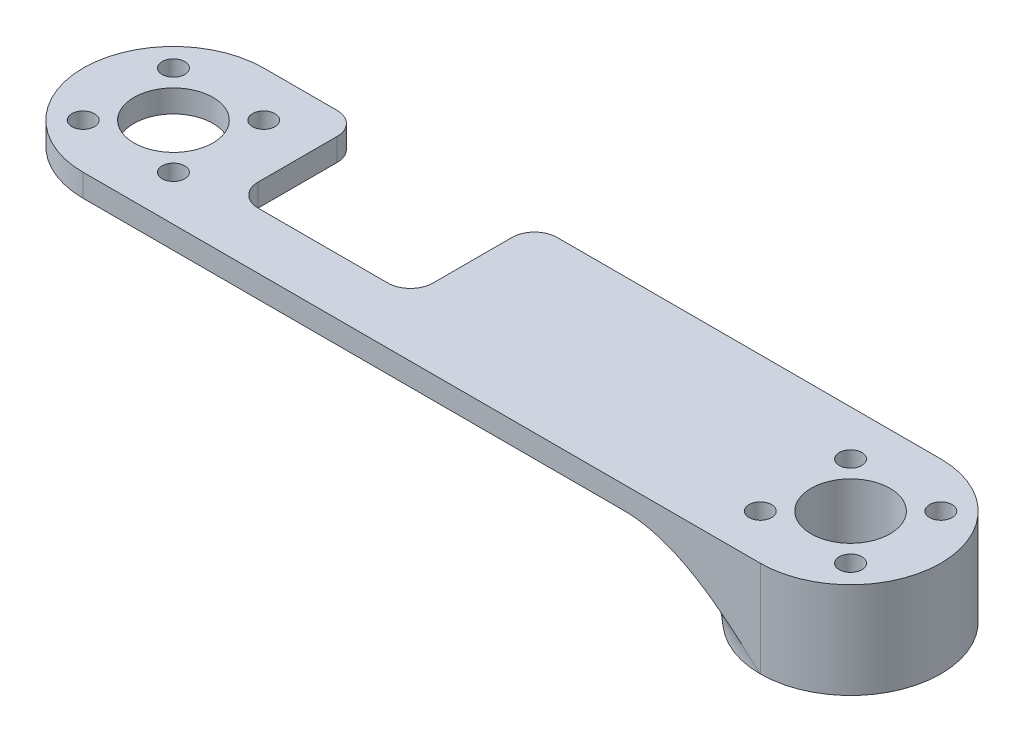
ISO-10303-21;
HEADER;
FILE_DESCRIPTION(('STEP AP214'),'2;1');
FILE_NAME('part.step','',(''),(''),'','','');
FILE_SCHEMA(('AUTOMOTIVE_DESIGN { 1 0 10303 214 1 1 1 1 }'));
ENDSEC;
DATA;
#1=APPLICATION_CONTEXT('core data for automotive mechanical design processes');
#2=APPLICATION_PROTOCOL_DEFINITION('international standard','automotive_design',2000,#1);
#3=PRODUCT_CONTEXT('',#1,'mechanical');
#4=PRODUCT('Part','Part','',(#3));
#5=PRODUCT_RELATED_PRODUCT_CATEGORY('part','',(#4));
#6=PRODUCT_DEFINITION_FORMATION('','',#4);
#7=PRODUCT_DEFINITION_CONTEXT('part definition',#1,'design');
#8=PRODUCT_DEFINITION('design','',#6,#7);
#9=PRODUCT_DEFINITION_SHAPE('','',#8);
#10=(LENGTH_UNIT() NAMED_UNIT(*) SI_UNIT(.MILLI.,.METRE.));
#11=(NAMED_UNIT(*) PLANE_ANGLE_UNIT() SI_UNIT($,.RADIAN.));
#12=(NAMED_UNIT(*) SI_UNIT($,.STERADIAN.) SOLID_ANGLE_UNIT());
#13=UNCERTAINTY_MEASURE_WITH_UNIT(LENGTH_MEASURE(1.E-05),#10,'distance_accuracy_value','');
#14=(GEOMETRIC_REPRESENTATION_CONTEXT(3) GLOBAL_UNCERTAINTY_ASSIGNED_CONTEXT((#13)) GLOBAL_UNIT_ASSIGNED_CONTEXT((#10,
#11,#12)) REPRESENTATION_CONTEXT('',''));
#15=CARTESIAN_POINT('',(0.,0.,0.));
#16=DIRECTION('',(0.,0.,1.));
#17=DIRECTION('',(1.,0.,0.));
#18=AXIS2_PLACEMENT_3D('',#15,#16,#17);
#19=CARTESIAN_POINT('',(-60.,4.,0.));
#20=DIRECTION('',(0.,1.,0.));
#21=DIRECTION('',(0.,0.,1.));
#22=AXIS2_PLACEMENT_3D('',#19,#20,#21);
#23=PLANE('',#22);
#24=CARTESIAN_POINT('',(-60.,4.,0.));
#25=DIRECTION('',(0.,1.,0.));
#26=DIRECTION('',(0.,0.,1.));
#27=AXIS2_PLACEMENT_3D('',#24,#25,#26);
#28=CIRCLE('',#27,7.);
#29=CARTESIAN_POINT('',(-60.,4.,7.));
#30=VERTEX_POINT('',#29);
#31=EDGE_CURVE('E510',#30,#30,#28,.T.);
#32=ORIENTED_EDGE('',*,*,#31,.F.);
#33=EDGE_LOOP('',(#32));
#34=FACE_BOUND('',#33,.T.);
#35=CARTESIAN_POINT('',(68.,4.,8.));
#36=DIRECTION('',(0.,1.,0.));
#37=DIRECTION('',(0.,0.,1.));
#38=AXIS2_PLACEMENT_3D('',#35,#36,#37);
#39=CIRCLE('',#38,2.);
#40=CARTESIAN_POINT('',(68.,4.,9.99999999999999));
#41=VERTEX_POINT('',#40);
#42=EDGE_CURVE('E529',#41,#41,#39,.T.);
#43=ORIENTED_EDGE('',*,*,#42,.F.);
#44=EDGE_LOOP('',(#43));
#45=FACE_BOUND('',#44,.T.);
#46=CARTESIAN_POINT('',(52.,4.,-7.99999999999999));
#47=DIRECTION('',(0.,1.,0.));
#48=DIRECTION('',(0.,0.,1.));
#49=AXIS2_PLACEMENT_3D('',#46,#47,#48);
#50=CIRCLE('',#49,2.);
#51=CARTESIAN_POINT('',(52.,4.,-5.99999999999999));
#52=VERTEX_POINT('',#51);
#53=EDGE_CURVE('E537',#52,#52,#50,.T.);
#54=ORIENTED_EDGE('',*,*,#53,.F.);
#55=EDGE_LOOP('',(#54));
#56=FACE_BOUND('',#55,.T.);
#57=CARTESIAN_POINT('',(-68.,4.,8.));
#58=DIRECTION('',(0.,1.,0.));
#59=DIRECTION('',(0.,0.,1.));
#60=AXIS2_PLACEMENT_3D('',#57,#58,#59);
#61=CIRCLE('',#60,2.);
#62=CARTESIAN_POINT('',(-68.,4.,10.));
#63=VERTEX_POINT('',#62);
#64=EDGE_CURVE('E550',#63,#63,#61,.T.);
#65=ORIENTED_EDGE('',*,*,#64,.F.);
#66=EDGE_LOOP('',(#65));
#67=FACE_BOUND('',#66,.T.);
#68=CARTESIAN_POINT('',(-52.,4.,-8.));
#69=DIRECTION('',(0.,1.,0.));
#70=DIRECTION('',(0.,0.,1.));
#71=AXIS2_PLACEMENT_3D('',#68,#69,#70);
#72=CIRCLE('',#71,2.);
#73=CARTESIAN_POINT('',(-52.,4.,-6.));
#74=VERTEX_POINT('',#73);
#75=EDGE_CURVE('E566',#74,#74,#72,.T.);
#76=ORIENTED_EDGE('',*,*,#75,.F.);
#77=EDGE_LOOP('',(#76));
#78=FACE_BOUND('',#77,.T.);
#79=DIRECTION('',(-1.,0.,0.));
#80=VECTOR('',#79,1.);
#81=CARTESIAN_POINT('',(-12.,4.,-16.));
#82=LINE('',#81,#80);
#83=CARTESIAN_POINT('',(60.,4.,-16.));
#84=VERTEX_POINT('',#83);
#85=CARTESIAN_POINT('',(-7.99999999999999,4.,-16.));
#86=VERTEX_POINT('',#85);
#87=EDGE_CURVE('E575',#84,#86,#82,.T.);
#88=ORIENTED_EDGE('',*,*,#87,.T.);
#89=CARTESIAN_POINT('',(-7.99999999999998,4.,-12.));
#90=DIRECTION('',(0.,1.,0.));
#91=DIRECTION('',(0.,0.,1.));
#92=AXIS2_PLACEMENT_3D('',#89,#90,#91);
#93=CIRCLE('',#92,4.);
#94=CARTESIAN_POINT('',(-12.,4.,-12.));
#95=VERTEX_POINT('',#94);
#96=EDGE_CURVE('E210',#86,#95,#93,.T.);
#97=ORIENTED_EDGE('',*,*,#96,.T.);
#98=DIRECTION('',(0.,0.,1.));
#99=VECTOR('',#98,1.);
#100=CARTESIAN_POINT('',(-12.,4.,-16.));
#101=LINE('',#100,#99);
#102=CARTESIAN_POINT('',(-12.,4.,2.));
#103=VERTEX_POINT('',#102);
#104=EDGE_CURVE('E578',#95,#103,#101,.T.);
#105=ORIENTED_EDGE('',*,*,#104,.T.);
#106=CARTESIAN_POINT('',(-16.,4.,2.));
#107=DIRECTION('',(0.,1.,0.));
#108=DIRECTION('',(0.,0.,1.));
#109=AXIS2_PLACEMENT_3D('',#106,#107,#108);
#110=CIRCLE('',#109,4.);
#111=CARTESIAN_POINT('',(-16.,4.,6.));
#112=VERTEX_POINT('',#111);
#113=EDGE_CURVE('E226',#103,#112,#110,.F.);
#114=ORIENTED_EDGE('',*,*,#113,.T.);
#115=DIRECTION('',(-1.,0.,0.));
#116=VECTOR('',#115,1.);
#117=CARTESIAN_POINT('',(-43.,4.,6.));
#118=LINE('',#117,#116);
#119=CARTESIAN_POINT('',(-39.,4.,6.));
#120=VERTEX_POINT('',#119);
#121=EDGE_CURVE('E582',#112,#120,#118,.T.);
#122=ORIENTED_EDGE('',*,*,#121,.T.);
#123=CARTESIAN_POINT('',(-39.,4.,2.));
#124=DIRECTION('',(0.,1.,0.));
#125=DIRECTION('',(0.,0.,1.));
#126=AXIS2_PLACEMENT_3D('',#123,#124,#125);
#127=CIRCLE('',#126,4.);
#128=CARTESIAN_POINT('',(-43.,4.,2.));
#129=VERTEX_POINT('',#128);
#130=EDGE_CURVE('E220',#120,#129,#127,.F.);
#131=ORIENTED_EDGE('',*,*,#130,.T.);
#132=DIRECTION('',(0.,0.,-1.));
#133=VECTOR('',#132,1.);
#134=CARTESIAN_POINT('',(-43.,4.,-6.));
#135=LINE('',#134,#133);
#136=CARTESIAN_POINT('',(-43.,4.,-12.));
#137=VERTEX_POINT('',#136);
#138=EDGE_CURVE('E586',#129,#137,#135,.T.);
#139=ORIENTED_EDGE('',*,*,#138,.T.);
#140=CARTESIAN_POINT('',(-47.,4.,-12.));
#141=DIRECTION('',(0.,1.,0.));
#142=DIRECTION('',(0.,0.,1.));
#143=AXIS2_PLACEMENT_3D('',#140,#141,#142);
#144=CIRCLE('',#143,4.);
#145=CARTESIAN_POINT('',(-47.,4.,-16.));
#146=VERTEX_POINT('',#145);
#147=EDGE_CURVE('E207',#137,#146,#144,.T.);
#148=ORIENTED_EDGE('',*,*,#147,.T.);
#149=DIRECTION('',(-1.,0.,0.));
#150=VECTOR('',#149,1.);
#151=CARTESIAN_POINT('',(-60.,4.,-16.));
#152=LINE('',#151,#150);
#153=CARTESIAN_POINT('',(-60.,4.,-16.));
#154=VERTEX_POINT('',#153);
#155=EDGE_CURVE('E160',#146,#154,#152,.T.);
#156=ORIENTED_EDGE('',*,*,#155,.T.);
#157=CARTESIAN_POINT('',(-60.,4.,0.));
#158=DIRECTION('',(0.,1.,0.));
#159=DIRECTION('',(0.,0.,1.));
#160=AXIS2_PLACEMENT_3D('',#157,#158,#159);
#161=CIRCLE('',#160,16.);
#162=CARTESIAN_POINT('',(-60.,4.,16.));
#163=VERTEX_POINT('',#162);
#164=EDGE_CURVE('E154',#154,#163,#161,.T.);
#165=ORIENTED_EDGE('',*,*,#164,.T.);
#166=DIRECTION('',(1.,0.,0.));
#167=VECTOR('',#166,1.);
#168=CARTESIAN_POINT('',(-60.,4.,16.));
#169=LINE('',#168,#167);
#170=CARTESIAN_POINT('',(60.,4.,16.));
#171=VERTEX_POINT('',#170);
#172=EDGE_CURVE('E144',#163,#171,#169,.T.);
#173=ORIENTED_EDGE('',*,*,#172,.T.);
#174=CARTESIAN_POINT('',(60.,4.,0.));
#175=DIRECTION('',(0.,1.,0.));
#176=DIRECTION('',(0.,0.,1.));
#177=AXIS2_PLACEMENT_3D('',#174,#175,#176);
#178=CIRCLE('',#177,16.);
#179=EDGE_CURVE('E153',#171,#84,#178,.T.);
#180=ORIENTED_EDGE('',*,*,#179,.T.);
#181=EDGE_LOOP('',(#88,#97,#105,#114,#122,#131,#139,#148,#156,#165,#173,#180));
#182=FACE_BOUND('',#181,.T.);
#183=CARTESIAN_POINT('',(-52.,4.,8.));
#184=DIRECTION('',(0.,1.,0.));
#185=DIRECTION('',(0.,0.,1.));
#186=AXIS2_PLACEMENT_3D('',#183,#184,#185);
#187=CIRCLE('',#186,2.);
#188=CARTESIAN_POINT('',(-52.,4.,10.));
#189=VERTEX_POINT('',#188);
#190=EDGE_CURVE('E558',#189,#189,#187,.T.);
#191=ORIENTED_EDGE('',*,*,#190,.F.);
#192=EDGE_LOOP('',(#191));
#193=FACE_BOUND('',#192,.T.);
#194=CARTESIAN_POINT('',(-68.,4.,-8.));
#195=DIRECTION('',(0.,1.,0.));
#196=DIRECTION('',(0.,0.,1.));
#197=AXIS2_PLACEMENT_3D('',#194,#195,#196);
#198=CIRCLE('',#197,2.);
#199=CARTESIAN_POINT('',(-68.,4.,-6.));
#200=VERTEX_POINT('',#199);
#201=EDGE_CURVE('E542',#200,#200,#198,.T.);
#202=ORIENTED_EDGE('',*,*,#201,.F.);
#203=EDGE_LOOP('',(#202));
#204=FACE_BOUND('',#203,.T.);
#205=CARTESIAN_POINT('',(68.,4.,-8.));
#206=DIRECTION('',(0.,1.,0.));
#207=DIRECTION('',(0.,0.,1.));
#208=AXIS2_PLACEMENT_3D('',#205,#206,#207);
#209=CIRCLE('',#208,2.);
#210=CARTESIAN_POINT('',(68.,4.,-6.));
#211=VERTEX_POINT('',#210);
#212=EDGE_CURVE('E533',#211,#211,#209,.T.);
#213=ORIENTED_EDGE('',*,*,#212,.F.);
#214=EDGE_LOOP('',(#213));
#215=FACE_BOUND('',#214,.T.);
#216=CARTESIAN_POINT('',(52.,4.,8.00000000000001));
#217=DIRECTION('',(0.,1.,0.));
#218=DIRECTION('',(0.,0.,1.));
#219=AXIS2_PLACEMENT_3D('',#216,#217,#218);
#220=CIRCLE('',#219,2.);
#221=CARTESIAN_POINT('',(52.,4.,10.));
#222=VERTEX_POINT('',#221);
#223=EDGE_CURVE('E520',#222,#222,#220,.T.);
#224=ORIENTED_EDGE('',*,*,#223,.F.);
#225=EDGE_LOOP('',(#224));
#226=FACE_BOUND('',#225,.T.);
#227=CARTESIAN_POINT('',(60.,4.,0.));
#228=DIRECTION('',(0.,1.,0.));
#229=DIRECTION('',(0.,0.,1.));
#230=AXIS2_PLACEMENT_3D('',#227,#228,#229);
#231=CIRCLE('',#230,6.99999999999999);
#232=CARTESIAN_POINT('',(60.,4.,6.99999999999999));
#233=VERTEX_POINT('',#232);
#234=EDGE_CURVE('E516',#233,#233,#231,.T.);
#235=ORIENTED_EDGE('',*,*,#234,.F.);
#236=EDGE_LOOP('',(#235));
#237=FACE_BOUND('',#236,.T.);
#238=ADVANCED_FACE('F41',(#34,#45,#56,#67,#78,#182,#193,#204,#215,#226,#237),#23,.T.);
#239=CARTESIAN_POINT('',(-60.,0.,0.));
#240=DIRECTION('',(0.,1.,0.));
#241=DIRECTION('',(0.,0.,1.));
#242=AXIS2_PLACEMENT_3D('',#239,#240,#241);
#243=PLANE('',#242);
#244=DIRECTION('',(-1.,0.,0.));
#245=VECTOR('',#244,1.);
#246=CARTESIAN_POINT('',(-12.,0.,-16.));
#247=LINE('',#246,#245);
#248=CARTESIAN_POINT('',(35.8132267551044,0.,-16.));
#249=VERTEX_POINT('',#248);
#250=CARTESIAN_POINT('',(-7.99999999999999,0.,-16.));
#251=VERTEX_POINT('',#250);
#252=EDGE_CURVE('E598',#249,#251,#247,.T.);
#253=ORIENTED_EDGE('',*,*,#252,.F.);
#254=CARTESIAN_POINT('',(60.,0.,0.));
#255=DIRECTION('',(0.,1.,0.));
#256=DIRECTION('',(0.,0.,1.));
#257=AXIS2_PLACEMENT_3D('',#254,#255,#256);
#258=CIRCLE('',#257,29.);
#259=CARTESIAN_POINT('',(35.8132267551043,0.,16.));
#260=VERTEX_POINT('',#259);
#261=EDGE_CURVE('E229',#249,#260,#258,.T.);
#262=ORIENTED_EDGE('',*,*,#261,.T.);
#263=DIRECTION('',(1.,0.,0.));
#264=VECTOR('',#263,1.);
#265=CARTESIAN_POINT('',(4.00000000000001,0.,16.));
#266=LINE('',#265,#264);
#267=CARTESIAN_POINT('',(-60.,0.,16.));
#268=VERTEX_POINT('',#267);
#269=EDGE_CURVE('E595',#268,#260,#266,.T.);
#270=ORIENTED_EDGE('',*,*,#269,.F.);
#271=CARTESIAN_POINT('',(-60.,0.,0.));
#272=DIRECTION('',(0.,1.,0.));
#273=DIRECTION('',(0.,0.,1.));
#274=AXIS2_PLACEMENT_3D('',#271,#272,#273);
#275=CIRCLE('',#274,16.);
#276=CARTESIAN_POINT('',(-60.,0.,-16.));
#277=VERTEX_POINT('',#276);
#278=EDGE_CURVE('E169',#277,#268,#275,.T.);
#279=ORIENTED_EDGE('',*,*,#278,.F.);
#280=DIRECTION('',(-1.,0.,0.));
#281=VECTOR('',#280,1.);
#282=CARTESIAN_POINT('',(-60.,0.,-16.));
#283=LINE('',#282,#281);
#284=CARTESIAN_POINT('',(-47.,0.,-16.));
#285=VERTEX_POINT('',#284);
#286=EDGE_CURVE('E165',#285,#277,#283,.T.);
#287=ORIENTED_EDGE('',*,*,#286,.F.);
#288=CARTESIAN_POINT('',(-47.,0.,-12.));
#289=DIRECTION('',(0.,1.,0.));
#290=DIRECTION('',(0.,0.,1.));
#291=AXIS2_PLACEMENT_3D('',#288,#289,#290);
#292=CIRCLE('',#291,4.);
#293=CARTESIAN_POINT('',(-43.,0.,-12.));
#294=VERTEX_POINT('',#293);
#295=EDGE_CURVE('E197',#285,#294,#292,.F.);
#296=ORIENTED_EDGE('',*,*,#295,.T.);
#297=DIRECTION('',(0.,0.,-1.));
#298=VECTOR('',#297,1.);
#299=CARTESIAN_POINT('',(-43.,0.,-16.));
#300=LINE('',#299,#298);
#301=CARTESIAN_POINT('',(-43.,0.,2.));
#302=VERTEX_POINT('',#301);
#303=EDGE_CURVE('E609',#302,#294,#300,.T.);
#304=ORIENTED_EDGE('',*,*,#303,.F.);
#305=CARTESIAN_POINT('',(-39.,0.,2.));
#306=DIRECTION('',(0.,1.,0.));
#307=DIRECTION('',(0.,0.,1.));
#308=AXIS2_PLACEMENT_3D('',#305,#306,#307);
#309=CIRCLE('',#308,4.);
#310=CARTESIAN_POINT('',(-39.,0.,6.));
#311=VERTEX_POINT('',#310);
#312=EDGE_CURVE('E217',#302,#311,#309,.T.);
#313=ORIENTED_EDGE('',*,*,#312,.T.);
#314=DIRECTION('',(-1.,0.,0.));
#315=VECTOR('',#314,1.);
#316=CARTESIAN_POINT('',(-43.,0.,6.));
#317=LINE('',#316,#315);
#318=CARTESIAN_POINT('',(-16.,0.,6.));
#319=VERTEX_POINT('',#318);
#320=EDGE_CURVE('E605',#319,#311,#317,.T.);
#321=ORIENTED_EDGE('',*,*,#320,.F.);
#322=CARTESIAN_POINT('',(-16.,0.,2.));
#323=DIRECTION('',(0.,1.,0.));
#324=DIRECTION('',(0.,0.,1.));
#325=AXIS2_PLACEMENT_3D('',#322,#323,#324);
#326=CIRCLE('',#325,4.);
#327=CARTESIAN_POINT('',(-12.,0.,2.));
#328=VERTEX_POINT('',#327);
#329=EDGE_CURVE('E223',#319,#328,#326,.T.);
#330=ORIENTED_EDGE('',*,*,#329,.T.);
#331=DIRECTION('',(0.,0.,1.));
#332=VECTOR('',#331,1.);
#333=CARTESIAN_POINT('',(-12.,0.,-6.00000000000001));
#334=LINE('',#333,#332);
#335=CARTESIAN_POINT('',(-12.,0.,-12.));
#336=VERTEX_POINT('',#335);
#337=EDGE_CURVE('E601',#336,#328,#334,.T.);
#338=ORIENTED_EDGE('',*,*,#337,.F.);
#339=CARTESIAN_POINT('',(-7.99999999999998,0.,-12.));
#340=DIRECTION('',(0.,1.,0.));
#341=DIRECTION('',(0.,0.,1.));
#342=AXIS2_PLACEMENT_3D('',#339,#340,#341);
#343=CIRCLE('',#342,4.);
#344=EDGE_CURVE('E200',#336,#251,#343,.F.);
#345=ORIENTED_EDGE('',*,*,#344,.T.);
#346=EDGE_LOOP('',(#253,#262,#270,#279,#287,#296,#304,#313,#321,#330,#338,#345));
#347=FACE_BOUND('',#346,.T.);
#348=CARTESIAN_POINT('',(-52.,0.,-8.));
#349=DIRECTION('',(0.,1.,0.));
#350=DIRECTION('',(0.,0.,1.));
#351=AXIS2_PLACEMENT_3D('',#348,#349,#350);
#352=CIRCLE('',#351,2.);
#353=CARTESIAN_POINT('',(-52.,0.,-6.));
#354=VERTEX_POINT('',#353);
#355=EDGE_CURVE('E562',#354,#354,#352,.T.);
#356=ORIENTED_EDGE('',*,*,#355,.T.);
#357=EDGE_LOOP('',(#356));
#358=FACE_BOUND('',#357,.T.);
#359=CARTESIAN_POINT('',(-52.,0.,8.));
#360=DIRECTION('',(0.,1.,0.));
#361=DIRECTION('',(0.,0.,1.));
#362=AXIS2_PLACEMENT_3D('',#359,#360,#361);
#363=CIRCLE('',#362,2.);
#364=CARTESIAN_POINT('',(-52.,0.,10.));
#365=VERTEX_POINT('',#364);
#366=EDGE_CURVE('E554',#365,#365,#363,.T.);
#367=ORIENTED_EDGE('',*,*,#366,.T.);
#368=EDGE_LOOP('',(#367));
#369=FACE_BOUND('',#368,.T.);
#370=CARTESIAN_POINT('',(-68.,0.,8.));
#371=DIRECTION('',(0.,1.,0.));
#372=DIRECTION('',(0.,0.,1.));
#373=AXIS2_PLACEMENT_3D('',#370,#371,#372);
#374=CIRCLE('',#373,2.);
#375=CARTESIAN_POINT('',(-68.,0.,10.));
#376=VERTEX_POINT('',#375);
#377=EDGE_CURVE('E546',#376,#376,#374,.T.);
#378=ORIENTED_EDGE('',*,*,#377,.T.);
#379=EDGE_LOOP('',(#378));
#380=FACE_BOUND('',#379,.T.);
#381=CARTESIAN_POINT('',(-68.,0.,-8.));
#382=DIRECTION('',(0.,1.,0.));
#383=DIRECTION('',(0.,0.,1.));
#384=AXIS2_PLACEMENT_3D('',#381,#382,#383);
#385=CIRCLE('',#384,2.);
#386=CARTESIAN_POINT('',(-68.,0.,-6.));
#387=VERTEX_POINT('',#386);
#388=EDGE_CURVE('E541',#387,#387,#385,.T.);
#389=ORIENTED_EDGE('',*,*,#388,.T.);
#390=EDGE_LOOP('',(#389));
#391=FACE_BOUND('',#390,.T.);
#392=CARTESIAN_POINT('',(-60.,0.,0.));
#393=DIRECTION('',(0.,1.,0.));
#394=DIRECTION('',(0.,0.,1.));
#395=AXIS2_PLACEMENT_3D('',#392,#393,#394);
#396=CIRCLE('',#395,7.);
#397=CARTESIAN_POINT('',(-60.,0.,7.));
#398=VERTEX_POINT('',#397);
#399=EDGE_CURVE('E513',#398,#398,#396,.T.);
#400=ORIENTED_EDGE('',*,*,#399,.T.);
#401=EDGE_LOOP('',(#400));
#402=FACE_BOUND('',#401,.T.);
#403=ADVANCED_FACE('F245',(#347,#358,#369,#380,#391,#402),#243,.F.);
#404=CARTESIAN_POINT('',(-60.,4.,0.));
#405=DIRECTION('',(0.,-1.,0.));
#406=DIRECTION('',(0.,0.,-1.));
#407=AXIS2_PLACEMENT_3D('',#404,#405,#406);
#408=CYLINDRICAL_SURFACE('',#407,16.);
#409=ORIENTED_EDGE('',*,*,#278,.T.);
#410=DIRECTION('',(0.,-1.,0.));
#411=VECTOR('',#410,1.);
#412=CARTESIAN_POINT('',(-60.,4.,16.));
#413=LINE('',#412,#411);
#414=EDGE_CURVE('E149',#163,#268,#413,.T.);
#415=ORIENTED_EDGE('',*,*,#414,.F.);
#416=ORIENTED_EDGE('',*,*,#164,.F.);
#417=DIRECTION('',(0.,-1.,0.));
#418=VECTOR('',#417,1.);
#419=CARTESIAN_POINT('',(-60.,4.,-16.));
#420=LINE('',#419,#418);
#421=EDGE_CURVE('E592',#154,#277,#420,.T.);
#422=ORIENTED_EDGE('',*,*,#421,.T.);
#423=EDGE_LOOP('',(#409,#415,#416,#422));
#424=FACE_BOUND('',#423,.T.);
#425=ADVANCED_FACE('F167',(#424),#408,.T.);
#426=CARTESIAN_POINT('',(4.00000000000001,4.,16.));
#427=DIRECTION('',(0.,0.,-1.));
#428=DIRECTION('',(-1.,0.,0.));
#429=AXIS2_PLACEMENT_3D('',#426,#427,#428);
#430=PLANE('',#429);
#431=ORIENTED_EDGE('',*,*,#269,.T.);
#432=CARTESIAN_POINT('',(35.8132267551043,0.,16.));
#433=CARTESIAN_POINT('',(36.0905895316791,3.02866078322834E-07,16.));
#434=CARTESIAN_POINT('',(36.3679057361623,-0.00617501172120525,16.));
#435=CARTESIAN_POINT('',(36.9219715713356,-0.0304686559429765,16.));
#436=CARTESIAN_POINT('',(37.1987212877857,-0.0485850192045447,16.));
#437=CARTESIAN_POINT('',(38.0267084699584,-0.120164139883938,16.));
#438=CARTESIAN_POINT('',(38.5765291000872,-0.190859453805513,16.));
#439=CARTESIAN_POINT('',(39.6629336402259,-0.373707082134891,16.));
#440=CARTESIAN_POINT('',(40.1995964721728,-0.485400275331651,16.));
#441=CARTESIAN_POINT('',(41.2637481363507,-0.746832848812867,16.));
#442=CARTESIAN_POINT('',(41.7912326126964,-0.896589794170852,16.));
#443=CARTESIAN_POINT('',(43.1164305828713,-1.32061035963194,16.));
#444=CARTESIAN_POINT('',(43.9066351383689,-1.61848579826866,16.));
#445=CARTESIAN_POINT('',(45.4573678596935,-2.28325678648619,16.));
#446=CARTESIAN_POINT('',(46.2178828333713,-2.65018260548694,16.));
#447=CARTESIAN_POINT('',(47.7125182288725,-3.44319238571225,16.));
#448=CARTESIAN_POINT('',(48.4464704754503,-3.86959061662994,16.));
#449=CARTESIAN_POINT('',(49.8850321136033,-4.76872961475223,16.));
#450=CARTESIAN_POINT('',(50.5896446935562,-5.24146532758027,16.));
#451=CARTESIAN_POINT('',(52.8224259277187,-6.82593289700588,16.));
#452=CARTESIAN_POINT('',(54.299207631324,-8.00937667003384,16.0000000000002));
#453=CARTESIAN_POINT('',(57.1776844033528,-10.456239375237,15.9999999999998));
#454=CARTESIAN_POINT('',(58.579472445293,-11.7195548355447,15.9999999999992));
#455=CARTESIAN_POINT('',(59.9874726330951,-12.9887079858511,16.));
#456=CARTESIAN_POINT('',(59.9937363154344,-12.9943539928172,16.));
#457=CARTESIAN_POINT('',(60.,-13.,16.));
#458=B_SPLINE_CURVE_WITH_KNOTS('',3,(#432,#433,#434,#435,#436,#437,#438,#439,#440,#441,#442,
#443,#444,#445,#446,#447,#448,#449,#450,#451,#452,#453,#454,#455,#456,#457),.UNSPECIFIED.,.F.,
.F.,(4,2,2,2,2,2,2,2,2,2,2,2,4),(0.,0.831936503229665,1.66373604287356,3.32480797018764,
4.96781900470678,6.61158961156077,9.14089547178664,11.6713126904196,14.2156471769886,
16.7597044421053,22.4283388828887,28.0897745241612,28.1150727454427),.UNSPECIFIED.);
#459=CARTESIAN_POINT('',(60.,-13.,16.));
#460=VERTEX_POINT('',#459);
#461=EDGE_CURVE('E56',#260,#460,#458,.T.);
#462=ORIENTED_EDGE('',*,*,#461,.T.);
#463=DIRECTION('',(0.,-1.,0.));
#464=VECTOR('',#463,1.);
#465=CARTESIAN_POINT('',(60.,4.,16.));
#466=LINE('',#465,#464);
#467=EDGE_CURVE('E70',#171,#460,#466,.T.);
#468=ORIENTED_EDGE('',*,*,#467,.F.);
#469=ORIENTED_EDGE('',*,*,#172,.F.);
#470=ORIENTED_EDGE('',*,*,#414,.T.);
#471=EDGE_LOOP('',(#431,#462,#468,#469,#470));
#472=FACE_BOUND('',#471,.T.);
#473=ADVANCED_FACE('F147',(#472),#430,.F.);
#474=CARTESIAN_POINT('',(60.,4.,0.));
#475=DIRECTION('',(0.,-1.,0.));
#476=DIRECTION('',(0.,0.,-1.));
#477=AXIS2_PLACEMENT_3D('',#474,#475,#476);
#478=CYLINDRICAL_SURFACE('',#477,16.);
#479=ORIENTED_EDGE('',*,*,#467,.T.);
#480=CARTESIAN_POINT('',(60.,-13.,0.));
#481=DIRECTION('',(0.,1.,0.));
#482=DIRECTION('',(0.,0.,1.));
#483=AXIS2_PLACEMENT_3D('',#480,#481,#482);
#484=CIRCLE('',#483,16.);
#485=CARTESIAN_POINT('',(60.,-13.,-16.));
#486=VERTEX_POINT('',#485);
#487=EDGE_CURVE('E523',#460,#486,#484,.T.);
#488=ORIENTED_EDGE('',*,*,#487,.T.);
#489=DIRECTION('',(0.,-1.,0.));
#490=VECTOR('',#489,1.);
#491=CARTESIAN_POINT('',(60.,4.,-16.));
#492=LINE('',#491,#490);
#493=EDGE_CURVE('E62',#84,#486,#492,.T.);
#494=ORIENTED_EDGE('',*,*,#493,.F.);
#495=ORIENTED_EDGE('',*,*,#179,.F.);
#496=EDGE_LOOP('',(#479,#488,#494,#495));
#497=FACE_BOUND('',#496,.T.);
#498=ADVANCED_FACE('F242',(#497),#478,.T.);
#499=CARTESIAN_POINT('',(-12.,4.,-16.));
#500=DIRECTION('',(0.,0.,1.));
#501=DIRECTION('',(1.,0.,0.));
#502=AXIS2_PLACEMENT_3D('',#499,#500,#501);
#503=PLANE('',#502);
#504=ORIENTED_EDGE('',*,*,#493,.T.);
#505=CARTESIAN_POINT('',(35.8132267551044,0.,-16.));
#506=CARTESIAN_POINT('',(36.0905895316905,3.02866078327603E-07,-16.));
#507=CARTESIAN_POINT('',(36.3679057361851,-0.00617501172171388,-16.));
#508=CARTESIAN_POINT('',(36.9219715713812,-0.0304686559454683,-16.));
#509=CARTESIAN_POINT('',(37.1987212878427,-0.0485850192085109,-16.));
#510=CARTESIAN_POINT('',(38.0267084700503,-0.12016413989379,-16.));
#511=CARTESIAN_POINT('',(38.5765291002025,-0.190859453821235,-16.));
#512=CARTESIAN_POINT('',(39.6629336403411,-0.373707082157923,-16.));
#513=CARTESIAN_POINT('',(40.1995964722649,-0.485400275352556,-16.));
#514=CARTESIAN_POINT('',(41.2637481363967,-0.746832848825881,-16.));
#515=CARTESIAN_POINT('',(41.7912326127192,-0.896589794178033,-16.));
#516=CARTESIAN_POINT('',(43.1164305828489,-1.32061035962494,-16.));
#517=CARTESIAN_POINT('',(43.9066351383246,-1.61848579825275,-16.));
#518=CARTESIAN_POINT('',(45.4573678596121,-2.28325678644818,-16.));
#519=CARTESIAN_POINT('',(46.2178828332747,-2.65018260543602,-16.));
#520=CARTESIAN_POINT('',(47.7125182287796,-3.44319238566261,-16.));
#521=CARTESIAN_POINT('',(48.4464704753747,-3.8695906165976,-16.));
#522=CARTESIAN_POINT('',(49.8850321135813,-4.76872961472348,-16.));
#523=CARTESIAN_POINT('',(50.5896446935709,-5.24146532753739,-16.0000000000001));
#524=CARTESIAN_POINT('',(52.8224259276704,-6.82593289709011,-15.9999999999999));
#525=CARTESIAN_POINT('',(54.2992076309741,-8.00937667048346,-15.9999999999995));
#526=CARTESIAN_POINT('',(57.177684403765,-10.456239374841,-16.0000000000005));
#527=CARTESIAN_POINT('',(58.5794724467688,-11.719554833938,-16.0000000000018));
#528=CARTESIAN_POINT('',(59.9874726331081,-12.9887079858366,-16.));
#529=CARTESIAN_POINT('',(59.9937363154409,-12.99435399281,-16.));
#530=CARTESIAN_POINT('',(60.,-13.,-16.));
#531=B_SPLINE_CURVE_WITH_KNOTS('',3,(#505,#506,#507,#508,#509,#510,#511,#512,#513,#514,#515,
#516,#517,#518,#519,#520,#521,#522,#523,#524,#525,#526,#527,#528,#529,#530),.UNSPECIFIED.,.F.,
.F.,(4,2,2,2,2,2,2,2,2,2,2,2,4),(0.,0.831936503263906,1.66373604294203,3.32480797032782,
4.96781900477834,6.6115896115608,9.14089547171659,11.6713126902899,14.2156471769348,
16.7597044421055,22.4283388829504,28.0897745241614,28.115072745443),.UNSPECIFIED.);
#532=EDGE_CURVE('E11',#486,#249,#531,.F.);
#533=ORIENTED_EDGE('',*,*,#532,.T.);
#534=ORIENTED_EDGE('',*,*,#252,.T.);
#535=DIRECTION('',(0.,-1.,0.));
#536=VECTOR('',#535,1.);
#537=CARTESIAN_POINT('',(-7.99999999999999,4.,-16.));
#538=LINE('',#537,#536);
#539=EDGE_CURVE('E204',#251,#86,#538,.F.);
#540=ORIENTED_EDGE('',*,*,#539,.T.);
#541=ORIENTED_EDGE('',*,*,#87,.F.);
#542=EDGE_LOOP('',(#504,#533,#534,#540,#541));
#543=FACE_BOUND('',#542,.T.);
#544=ADVANCED_FACE('F298',(#543),#503,.F.);
#545=CARTESIAN_POINT('',(-12.,4.,-6.00000000000001));
#546=DIRECTION('',(1.,0.,0.));
#547=DIRECTION('',(0.,0.,-1.));
#548=AXIS2_PLACEMENT_3D('',#545,#546,#547);
#549=PLANE('',#548);
#550=ORIENTED_EDGE('',*,*,#337,.T.);
#551=DIRECTION('',(0.,-1.,0.));
#552=VECTOR('',#551,1.);
#553=CARTESIAN_POINT('',(-12.,4.,2.));
#554=LINE('',#553,#552);
#555=EDGE_CURVE('E194',#328,#103,#554,.F.);
#556=ORIENTED_EDGE('',*,*,#555,.T.);
#557=ORIENTED_EDGE('',*,*,#104,.F.);
#558=DIRECTION('',(0.,-1.,0.));
#559=VECTOR('',#558,1.);
#560=CARTESIAN_POINT('',(-12.,4.,-12.));
#561=LINE('',#560,#559);
#562=EDGE_CURVE('E190',#95,#336,#561,.T.);
#563=ORIENTED_EDGE('',*,*,#562,.T.);
#564=EDGE_LOOP('',(#550,#556,#557,#563));
#565=FACE_BOUND('',#564,.T.);
#566=ADVANCED_FACE('F296',(#565),#549,.F.);
#567=CARTESIAN_POINT('',(-43.,4.,6.));
#568=DIRECTION('',(0.,0.,1.));
#569=DIRECTION('',(1.,0.,0.));
#570=AXIS2_PLACEMENT_3D('',#567,#568,#569);
#571=PLANE('',#570);
#572=ORIENTED_EDGE('',*,*,#320,.T.);
#573=DIRECTION('',(0.,-1.,0.));
#574=VECTOR('',#573,1.);
#575=CARTESIAN_POINT('',(-39.,4.,6.));
#576=LINE('',#575,#574);
#577=EDGE_CURVE('E187',#311,#120,#576,.F.);
#578=ORIENTED_EDGE('',*,*,#577,.T.);
#579=ORIENTED_EDGE('',*,*,#121,.F.);
#580=DIRECTION('',(0.,-1.,0.));
#581=VECTOR('',#580,1.);
#582=CARTESIAN_POINT('',(-16.,0.,6.));
#583=LINE('',#582,#581);
#584=EDGE_CURVE('E183',#112,#319,#583,.T.);
#585=ORIENTED_EDGE('',*,*,#584,.T.);
#586=EDGE_LOOP('',(#572,#578,#579,#585));
#587=FACE_BOUND('',#586,.T.);
#588=ADVANCED_FACE('F292',(#587),#571,.F.);
#589=CARTESIAN_POINT('',(-43.,4.,-16.));
#590=DIRECTION('',(-1.,0.,0.));
#591=DIRECTION('',(0.,0.,1.));
#592=AXIS2_PLACEMENT_3D('',#589,#590,#591);
#593=PLANE('',#592);
#594=ORIENTED_EDGE('',*,*,#138,.F.);
#595=DIRECTION('',(0.,-1.,0.));
#596=VECTOR('',#595,1.);
#597=CARTESIAN_POINT('',(-43.,0.,2.));
#598=LINE('',#597,#596);
#599=EDGE_CURVE('E175',#129,#302,#598,.T.);
#600=ORIENTED_EDGE('',*,*,#599,.T.);
#601=ORIENTED_EDGE('',*,*,#303,.T.);
#602=DIRECTION('',(0.,-1.,0.));
#603=VECTOR('',#602,1.);
#604=CARTESIAN_POINT('',(-43.,4.,-12.));
#605=LINE('',#604,#603);
#606=EDGE_CURVE('E171',#294,#137,#605,.F.);
#607=ORIENTED_EDGE('',*,*,#606,.T.);
#608=EDGE_LOOP('',(#594,#600,#601,#607));
#609=FACE_BOUND('',#608,.T.);
#610=ADVANCED_FACE('F288',(#609),#593,.F.);
#611=CARTESIAN_POINT('',(-60.,4.,-16.));
#612=DIRECTION('',(0.,0.,1.));
#613=DIRECTION('',(1.,0.,0.));
#614=AXIS2_PLACEMENT_3D('',#611,#612,#613);
#615=PLANE('',#614);
#616=ORIENTED_EDGE('',*,*,#155,.F.);
#617=DIRECTION('',(0.,-1.,0.));
#618=VECTOR('',#617,1.);
#619=CARTESIAN_POINT('',(-47.,4.,-16.));
#620=LINE('',#619,#618);
#621=EDGE_CURVE('E213',#146,#285,#620,.T.);
#622=ORIENTED_EDGE('',*,*,#621,.T.);
#623=ORIENTED_EDGE('',*,*,#286,.T.);
#624=ORIENTED_EDGE('',*,*,#421,.F.);
#625=EDGE_LOOP('',(#616,#622,#623,#624));
#626=FACE_BOUND('',#625,.T.);
#627=ADVANCED_FACE('F285',(#626),#615,.F.);
#628=CARTESIAN_POINT('',(-52.,4.,-8.));
#629=DIRECTION('',(0.,-1.,0.));
#630=DIRECTION('',(0.,0.,-1.));
#631=AXIS2_PLACEMENT_3D('',#628,#629,#630);
#632=CYLINDRICAL_SURFACE('',#631,2.);
#633=ORIENTED_EDGE('',*,*,#75,.T.);
#634=EDGE_LOOP('',(#633));
#635=FACE_BOUND('',#634,.T.);
#636=ORIENTED_EDGE('',*,*,#355,.F.);
#637=EDGE_LOOP('',(#636));
#638=FACE_BOUND('',#637,.T.);
#639=ADVANCED_FACE('F282',(#635,#638),#632,.F.);
#640=CARTESIAN_POINT('',(-52.,4.,8.));
#641=DIRECTION('',(0.,-1.,0.));
#642=DIRECTION('',(0.,0.,-1.));
#643=AXIS2_PLACEMENT_3D('',#640,#641,#642);
#644=CYLINDRICAL_SURFACE('',#643,2.);
#645=ORIENTED_EDGE('',*,*,#190,.T.);
#646=EDGE_LOOP('',(#645));
#647=FACE_BOUND('',#646,.T.);
#648=ORIENTED_EDGE('',*,*,#366,.F.);
#649=EDGE_LOOP('',(#648));
#650=FACE_BOUND('',#649,.T.);
#651=ADVANCED_FACE('F472',(#647,#650),#644,.F.);
#652=CARTESIAN_POINT('',(-68.,4.,8.));
#653=DIRECTION('',(0.,-1.,0.));
#654=DIRECTION('',(0.,0.,-1.));
#655=AXIS2_PLACEMENT_3D('',#652,#653,#654);
#656=CYLINDRICAL_SURFACE('',#655,2.);
#657=ORIENTED_EDGE('',*,*,#64,.T.);
#658=EDGE_LOOP('',(#657));
#659=FACE_BOUND('',#658,.T.);
#660=ORIENTED_EDGE('',*,*,#377,.F.);
#661=EDGE_LOOP('',(#660));
#662=FACE_BOUND('',#661,.T.);
#663=ADVANCED_FACE('F481',(#659,#662),#656,.F.);
#664=CARTESIAN_POINT('',(-68.,4.,-8.));
#665=DIRECTION('',(0.,-1.,0.));
#666=DIRECTION('',(0.,0.,-1.));
#667=AXIS2_PLACEMENT_3D('',#664,#665,#666);
#668=CYLINDRICAL_SURFACE('',#667,2.);
#669=ORIENTED_EDGE('',*,*,#201,.T.);
#670=EDGE_LOOP('',(#669));
#671=FACE_BOUND('',#670,.T.);
#672=ORIENTED_EDGE('',*,*,#388,.F.);
#673=EDGE_LOOP('',(#672));
#674=FACE_BOUND('',#673,.T.);
#675=ADVANCED_FACE('F315',(#671,#674),#668,.F.);
#676=CARTESIAN_POINT('',(52.,4.,-7.99999999999999));
#677=DIRECTION('',(0.,-1.,0.));
#678=DIRECTION('',(0.,0.,-1.));
#679=AXIS2_PLACEMENT_3D('',#676,#677,#678);
#680=CYLINDRICAL_SURFACE('',#679,2.);
#681=ORIENTED_EDGE('',*,*,#53,.T.);
#682=EDGE_LOOP('',(#681));
#683=FACE_BOUND('',#682,.T.);
#684=CARTESIAN_POINT('',(52.,-13.,-7.99999999999999));
#685=DIRECTION('',(0.,1.,0.));
#686=DIRECTION('',(0.,0.,1.));
#687=AXIS2_PLACEMENT_3D('',#684,#685,#686);
#688=CIRCLE('',#687,2.);
#689=CARTESIAN_POINT('',(52.,-13.,-5.99999999999999));
#690=VERTEX_POINT('',#689);
#691=EDGE_CURVE('E632',#690,#690,#688,.T.);
#692=ORIENTED_EDGE('',*,*,#691,.F.);
#693=EDGE_LOOP('',(#692));
#694=FACE_BOUND('',#693,.T.);
#695=ADVANCED_FACE('F310',(#683,#694),#680,.F.);
#696=CARTESIAN_POINT('',(68.,4.,-8.));
#697=DIRECTION('',(0.,-1.,0.));
#698=DIRECTION('',(0.,0.,-1.));
#699=AXIS2_PLACEMENT_3D('',#696,#697,#698);
#700=CYLINDRICAL_SURFACE('',#699,2.);
#701=ORIENTED_EDGE('',*,*,#212,.T.);
#702=EDGE_LOOP('',(#701));
#703=FACE_BOUND('',#702,.T.);
#704=CARTESIAN_POINT('',(68.,-13.,-8.));
#705=DIRECTION('',(0.,1.,0.));
#706=DIRECTION('',(0.,0.,1.));
#707=AXIS2_PLACEMENT_3D('',#704,#705,#706);
#708=CIRCLE('',#707,2.);
#709=CARTESIAN_POINT('',(68.,-13.,-6.));
#710=VERTEX_POINT('',#709);
#711=EDGE_CURVE('E638',#710,#710,#708,.T.);
#712=ORIENTED_EDGE('',*,*,#711,.F.);
#713=EDGE_LOOP('',(#712));
#714=FACE_BOUND('',#713,.T.);
#715=ADVANCED_FACE('F314',(#703,#714),#700,.F.);
#716=CARTESIAN_POINT('',(68.,4.,8.));
#717=DIRECTION('',(0.,-1.,0.));
#718=DIRECTION('',(0.,0.,-1.));
#719=AXIS2_PLACEMENT_3D('',#716,#717,#718);
#720=CYLINDRICAL_SURFACE('',#719,2.);
#721=ORIENTED_EDGE('',*,*,#42,.T.);
#722=EDGE_LOOP('',(#721));
#723=FACE_BOUND('',#722,.T.);
#724=CARTESIAN_POINT('',(68.,-13.,8.));
#725=DIRECTION('',(0.,1.,0.));
#726=DIRECTION('',(0.,0.,1.));
#727=AXIS2_PLACEMENT_3D('',#724,#725,#726);
#728=CIRCLE('',#727,2.);
#729=CARTESIAN_POINT('',(68.,-13.,9.99999999999999));
#730=VERTEX_POINT('',#729);
#731=EDGE_CURVE('E646',#730,#730,#728,.T.);
#732=ORIENTED_EDGE('',*,*,#731,.F.);
#733=EDGE_LOOP('',(#732));
#734=FACE_BOUND('',#733,.T.);
#735=ADVANCED_FACE('F323',(#723,#734),#720,.F.);
#736=CARTESIAN_POINT('',(52.,4.,8.00000000000001));
#737=DIRECTION('',(0.,-1.,0.));
#738=DIRECTION('',(0.,0.,-1.));
#739=AXIS2_PLACEMENT_3D('',#736,#737,#738);
#740=CYLINDRICAL_SURFACE('',#739,2.);
#741=ORIENTED_EDGE('',*,*,#223,.T.);
#742=EDGE_LOOP('',(#741));
#743=FACE_BOUND('',#742,.T.);
#744=CARTESIAN_POINT('',(52.,-13.,8.00000000000001));
#745=DIRECTION('',(0.,1.,0.));
#746=DIRECTION('',(0.,0.,1.));
#747=AXIS2_PLACEMENT_3D('',#744,#745,#746);
#748=CIRCLE('',#747,2.);
#749=CARTESIAN_POINT('',(52.,-13.,10.));
#750=VERTEX_POINT('',#749);
#751=EDGE_CURVE('E642',#750,#750,#748,.T.);
#752=ORIENTED_EDGE('',*,*,#751,.F.);
#753=EDGE_LOOP('',(#752));
#754=FACE_BOUND('',#753,.T.);
#755=ADVANCED_FACE('F331',(#743,#754),#740,.F.);
#756=CARTESIAN_POINT('',(-60.,4.,0.));
#757=DIRECTION('',(0.,-1.,0.));
#758=DIRECTION('',(0.,0.,-1.));
#759=AXIS2_PLACEMENT_3D('',#756,#757,#758);
#760=CYLINDRICAL_SURFACE('',#759,7.);
#761=ORIENTED_EDGE('',*,*,#31,.T.);
#762=EDGE_LOOP('',(#761));
#763=FACE_BOUND('',#762,.T.);
#764=ORIENTED_EDGE('',*,*,#399,.F.);
#765=EDGE_LOOP('',(#764));
#766=FACE_BOUND('',#765,.T.);
#767=ADVANCED_FACE('F339',(#763,#766),#760,.F.);
#768=CARTESIAN_POINT('',(60.,4.,0.));
#769=DIRECTION('',(0.,-1.,0.));
#770=DIRECTION('',(0.,0.,-1.));
#771=AXIS2_PLACEMENT_3D('',#768,#769,#770);
#772=CYLINDRICAL_SURFACE('',#771,6.99999999999999);
#773=ORIENTED_EDGE('',*,*,#234,.T.);
#774=EDGE_LOOP('',(#773));
#775=FACE_BOUND('',#774,.T.);
#776=CARTESIAN_POINT('',(60.,-13.,0.));
#777=DIRECTION('',(0.,1.,0.));
#778=DIRECTION('',(0.,0.,1.));
#779=AXIS2_PLACEMENT_3D('',#776,#777,#778);
#780=CIRCLE('',#779,6.99999999999999);
#781=CARTESIAN_POINT('',(60.,-13.,6.99999999999999));
#782=VERTEX_POINT('',#781);
#783=EDGE_CURVE('E629',#782,#782,#780,.T.);
#784=ORIENTED_EDGE('',*,*,#783,.F.);
#785=EDGE_LOOP('',(#784));
#786=FACE_BOUND('',#785,.T.);
#787=ADVANCED_FACE('F250',(#775,#786),#772,.F.);
#788=CARTESIAN_POINT('',(-39.,4.,2.));
#789=DIRECTION('',(0.,1.,0.));
#790=DIRECTION('',(0.,0.,1.));
#791=AXIS2_PLACEMENT_3D('',#788,#789,#790);
#792=CYLINDRICAL_SURFACE('',#791,4.);
#793=ORIENTED_EDGE('',*,*,#130,.F.);
#794=ORIENTED_EDGE('',*,*,#577,.F.);
#795=ORIENTED_EDGE('',*,*,#312,.F.);
#796=ORIENTED_EDGE('',*,*,#599,.F.);
#797=EDGE_LOOP('',(#793,#794,#795,#796));
#798=FACE_BOUND('',#797,.T.);
#799=ADVANCED_FACE('F246',(#798),#792,.F.);
#800=CARTESIAN_POINT('',(-16.,4.,2.));
#801=DIRECTION('',(0.,1.,0.));
#802=DIRECTION('',(0.,0.,1.));
#803=AXIS2_PLACEMENT_3D('',#800,#801,#802);
#804=CYLINDRICAL_SURFACE('',#803,4.);
#805=ORIENTED_EDGE('',*,*,#113,.F.);
#806=ORIENTED_EDGE('',*,*,#555,.F.);
#807=ORIENTED_EDGE('',*,*,#329,.F.);
#808=ORIENTED_EDGE('',*,*,#584,.F.);
#809=EDGE_LOOP('',(#805,#806,#807,#808));
#810=FACE_BOUND('',#809,.T.);
#811=ADVANCED_FACE('F249',(#810),#804,.F.);
#812=CARTESIAN_POINT('',(-7.99999999999998,4.,-12.));
#813=DIRECTION('',(0.,-1.,0.));
#814=DIRECTION('',(0.,0.,-1.));
#815=AXIS2_PLACEMENT_3D('',#812,#813,#814);
#816=CYLINDRICAL_SURFACE('',#815,4.);
#817=ORIENTED_EDGE('',*,*,#96,.F.);
#818=ORIENTED_EDGE('',*,*,#539,.F.);
#819=ORIENTED_EDGE('',*,*,#344,.F.);
#820=ORIENTED_EDGE('',*,*,#562,.F.);
#821=EDGE_LOOP('',(#817,#818,#819,#820));
#822=FACE_BOUND('',#821,.T.);
#823=ADVANCED_FACE('F254',(#822),#816,.T.);
#824=CARTESIAN_POINT('',(-47.,4.,-12.));
#825=DIRECTION('',(0.,-1.,0.));
#826=DIRECTION('',(0.,0.,-1.));
#827=AXIS2_PLACEMENT_3D('',#824,#825,#826);
#828=CYLINDRICAL_SURFACE('',#827,4.);
#829=ORIENTED_EDGE('',*,*,#147,.F.);
#830=ORIENTED_EDGE('',*,*,#606,.F.);
#831=ORIENTED_EDGE('',*,*,#295,.F.);
#832=ORIENTED_EDGE('',*,*,#621,.F.);
#833=EDGE_LOOP('',(#829,#830,#831,#832));
#834=FACE_BOUND('',#833,.T.);
#835=ADVANCED_FACE('F257',(#834),#828,.T.);
#836=CARTESIAN_POINT('',(60.,-13.,0.));
#837=DIRECTION('',(0.,1.,0.));
#838=DIRECTION('',(0.,0.,1.));
#839=AXIS2_PLACEMENT_3D('',#836,#837,#838);
#840=PLANE('',#839);
#841=ORIENTED_EDGE('',*,*,#731,.T.);
#842=EDGE_LOOP('',(#841));
#843=FACE_BOUND('',#842,.T.);
#844=ORIENTED_EDGE('',*,*,#751,.T.);
#845=EDGE_LOOP('',(#844));
#846=FACE_BOUND('',#845,.T.);
#847=ORIENTED_EDGE('',*,*,#711,.T.);
#848=EDGE_LOOP('',(#847));
#849=FACE_BOUND('',#848,.T.);
#850=ORIENTED_EDGE('',*,*,#691,.T.);
#851=EDGE_LOOP('',(#850));
#852=FACE_BOUND('',#851,.T.);
#853=ORIENTED_EDGE('',*,*,#783,.T.);
#854=EDGE_LOOP('',(#853));
#855=FACE_BOUND('',#854,.T.);
#856=ORIENTED_EDGE('',*,*,#487,.F.);
#857=EDGE_CURVE('E624',#486,#460,#484,.T.);
#858=ORIENTED_EDGE('',*,*,#857,.F.);
#859=EDGE_LOOP('',(#856,#858));
#860=FACE_BOUND('',#859,.T.);
#861=ADVANCED_FACE('F260',(#843,#846,#849,#852,#855,#860),#840,.F.);
#862=CARTESIAN_POINT('',(60.,-13.,0.));
#863=DIRECTION('',(0.,1.,0.));
#864=DIRECTION('',(0.,0.,1.));
#865=AXIS2_PLACEMENT_3D('',#862,#863,#864);
#866=TOROIDAL_SURFACE('',#865,29.,13.);
#867=ORIENTED_EDGE('',*,*,#532,.F.);
#868=ORIENTED_EDGE('',*,*,#857,.T.);
#869=ORIENTED_EDGE('',*,*,#461,.F.);
#870=ORIENTED_EDGE('',*,*,#261,.F.);
#871=EDGE_LOOP('',(#867,#868,#869,#870));
#872=FACE_BOUND('',#871,.T.);
#873=ADVANCED_FACE('F43',(#872),#866,.F.);
#874=CLOSED_SHELL('',(#238,#403,#425,#473,#498,#544,#566,#588,#610,#627,#639,#651,#663,#675,
#695,#715,#735,#755,#767,#787,#799,#811,#823,#835,#861,#873));
#875=MANIFOLD_SOLID_BREP('B2',#874);
#876=ADVANCED_BREP_SHAPE_REPRESENTATION('',(#18,#875),#14);
#877=SHAPE_DEFINITION_REPRESENTATION(#9,#876);
ENDSEC;
END-ISO-10303-21;
